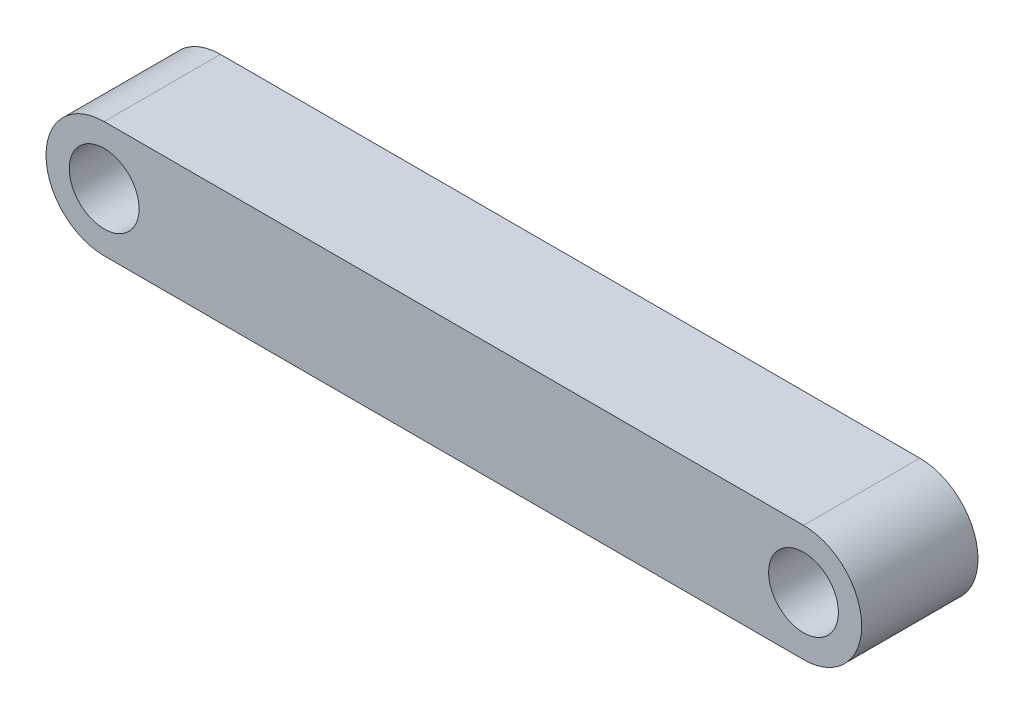
ISO-10303-21;
HEADER;
FILE_DESCRIPTION(('STEP AP214'),'2;1');
FILE_NAME('part.step','',(''),(''),'','','');
FILE_SCHEMA(('AUTOMOTIVE_DESIGN { 1 0 10303 214 1 1 1 1 }'));
ENDSEC;
DATA;
#1=APPLICATION_CONTEXT('core data for automotive mechanical design processes');
#2=APPLICATION_PROTOCOL_DEFINITION('international standard','automotive_design',2000,#1);
#3=PRODUCT_CONTEXT('',#1,'mechanical');
#4=PRODUCT('Part','Part','',(#3));
#5=PRODUCT_RELATED_PRODUCT_CATEGORY('part','',(#4));
#6=PRODUCT_DEFINITION_FORMATION('','',#4);
#7=PRODUCT_DEFINITION_CONTEXT('part definition',#1,'design');
#8=PRODUCT_DEFINITION('design','',#6,#7);
#9=PRODUCT_DEFINITION_SHAPE('','',#8);
#10=(LENGTH_UNIT() NAMED_UNIT(*) SI_UNIT(.MILLI.,.METRE.));
#11=(NAMED_UNIT(*) PLANE_ANGLE_UNIT() SI_UNIT($,.RADIAN.));
#12=(NAMED_UNIT(*) SI_UNIT($,.STERADIAN.) SOLID_ANGLE_UNIT());
#13=UNCERTAINTY_MEASURE_WITH_UNIT(LENGTH_MEASURE(1.E-05),#10,'distance_accuracy_value','');
#14=(GEOMETRIC_REPRESENTATION_CONTEXT(3) GLOBAL_UNCERTAINTY_ASSIGNED_CONTEXT((#13)) GLOBAL_UNIT_ASSIGNED_CONTEXT((#10,
#11,#12)) REPRESENTATION_CONTEXT('',''));
#15=CARTESIAN_POINT('',(0.,0.,0.));
#16=DIRECTION('',(0.,0.,1.));
#17=DIRECTION('',(1.,0.,0.));
#18=AXIS2_PLACEMENT_3D('',#15,#16,#17);
#19=CARTESIAN_POINT('',(-15.03125,0.,2.5));
#20=DIRECTION('',(0.,0.,1.));
#21=DIRECTION('',(1.,0.,0.));
#22=AXIS2_PLACEMENT_3D('',#19,#20,#21);
#23=PLANE('',#22);
#24=CARTESIAN_POINT('',(-15.03125,0.,2.5));
#25=DIRECTION('',(0.,0.,1.));
#26=DIRECTION('',(1.,0.,0.));
#27=AXIS2_PLACEMENT_3D('',#24,#25,#26);
#28=CIRCLE('',#27,1.5);
#29=CARTESIAN_POINT('',(-13.53125,0.,2.5));
#30=VERTEX_POINT('',#29);
#31=EDGE_CURVE('E102',#30,#30,#28,.T.);
#32=ORIENTED_EDGE('',*,*,#31,.F.);
#33=EDGE_LOOP('',(#32));
#34=FACE_BOUND('',#33,.T.);
#35=CARTESIAN_POINT('',(-15.03125,0.,2.5));
#36=DIRECTION('',(0.,0.,1.));
#37=DIRECTION('',(1.,0.,0.));
#38=AXIS2_PLACEMENT_3D('',#35,#36,#37);
#39=CIRCLE('',#38,2.5);
#40=CARTESIAN_POINT('',(-15.03125,2.5,2.5));
#41=VERTEX_POINT('',#40);
#42=CARTESIAN_POINT('',(-15.03125,-2.5,2.5));
#43=VERTEX_POINT('',#42);
#44=EDGE_CURVE('E87',#41,#43,#39,.T.);
#45=ORIENTED_EDGE('',*,*,#44,.T.);
#46=DIRECTION('',(1.,0.,0.));
#47=VECTOR('',#46,1.);
#48=CARTESIAN_POINT('',(-15.03125,-2.5,2.5));
#49=LINE('',#48,#47);
#50=CARTESIAN_POINT('',(15.03125,-2.49999999999999,2.5));
#51=VERTEX_POINT('',#50);
#52=EDGE_CURVE('E82',#43,#51,#49,.T.);
#53=ORIENTED_EDGE('',*,*,#52,.T.);
#54=CARTESIAN_POINT('',(15.03125,0.,2.5));
#55=DIRECTION('',(0.,0.,1.));
#56=DIRECTION('',(1.,0.,0.));
#57=AXIS2_PLACEMENT_3D('',#54,#55,#56);
#58=CIRCLE('',#57,2.5);
#59=CARTESIAN_POINT('',(15.03125,2.50000000000001,2.5));
#60=VERTEX_POINT('',#59);
#61=EDGE_CURVE('E85',#51,#60,#58,.T.);
#62=ORIENTED_EDGE('',*,*,#61,.T.);
#63=DIRECTION('',(-1.,0.,0.));
#64=VECTOR('',#63,1.);
#65=CARTESIAN_POINT('',(-15.03125,2.5,2.5));
#66=LINE('',#65,#64);
#67=EDGE_CURVE('E52',#60,#41,#66,.T.);
#68=ORIENTED_EDGE('',*,*,#67,.T.);
#69=EDGE_LOOP('',(#45,#53,#62,#68));
#70=FACE_BOUND('',#69,.T.);
#71=CARTESIAN_POINT('',(15.03125,0.,2.5));
#72=DIRECTION('',(0.,0.,1.));
#73=DIRECTION('',(1.,0.,0.));
#74=AXIS2_PLACEMENT_3D('',#71,#72,#73);
#75=CIRCLE('',#74,1.5);
#76=CARTESIAN_POINT('',(16.53125,0.,2.5));
#77=VERTEX_POINT('',#76);
#78=EDGE_CURVE('E117',#77,#77,#75,.T.);
#79=ORIENTED_EDGE('',*,*,#78,.F.);
#80=EDGE_LOOP('',(#79));
#81=FACE_BOUND('',#80,.T.);
#82=ADVANCED_FACE('F35',(#34,#70,#81),#23,.T.);
#83=CARTESIAN_POINT('',(-15.03125,0.,-2.5));
#84=DIRECTION('',(0.,0.,1.));
#85=DIRECTION('',(1.,0.,0.));
#86=AXIS2_PLACEMENT_3D('',#83,#84,#85);
#87=PLANE('',#86);
#88=CARTESIAN_POINT('',(-15.03125,0.,-2.5));
#89=DIRECTION('',(0.,0.,1.));
#90=DIRECTION('',(1.,0.,0.));
#91=AXIS2_PLACEMENT_3D('',#88,#89,#90);
#92=CIRCLE('',#91,2.5);
#93=CARTESIAN_POINT('',(-15.03125,2.5,-2.5));
#94=VERTEX_POINT('',#93);
#95=CARTESIAN_POINT('',(-15.03125,-2.5,-2.5));
#96=VERTEX_POINT('',#95);
#97=EDGE_CURVE('E99',#94,#96,#92,.T.);
#98=ORIENTED_EDGE('',*,*,#97,.F.);
#99=DIRECTION('',(-1.,0.,0.));
#100=VECTOR('',#99,1.);
#101=CARTESIAN_POINT('',(-15.03125,2.5,-2.5));
#102=LINE('',#101,#100);
#103=CARTESIAN_POINT('',(15.03125,2.50000000000001,-2.5));
#104=VERTEX_POINT('',#103);
#105=EDGE_CURVE('E75',#104,#94,#102,.T.);
#106=ORIENTED_EDGE('',*,*,#105,.F.);
#107=CARTESIAN_POINT('',(15.03125,0.,-2.5));
#108=DIRECTION('',(0.,0.,1.));
#109=DIRECTION('',(1.,0.,0.));
#110=AXIS2_PLACEMENT_3D('',#107,#108,#109);
#111=CIRCLE('',#110,2.5);
#112=CARTESIAN_POINT('',(15.03125,-2.49999999999999,-2.5));
#113=VERTEX_POINT('',#112);
#114=EDGE_CURVE('E69',#113,#104,#111,.T.);
#115=ORIENTED_EDGE('',*,*,#114,.F.);
#116=DIRECTION('',(1.,0.,0.));
#117=VECTOR('',#116,1.);
#118=CARTESIAN_POINT('',(-15.03125,-2.5,-2.5));
#119=LINE('',#118,#117);
#120=EDGE_CURVE('E91',#96,#113,#119,.T.);
#121=ORIENTED_EDGE('',*,*,#120,.F.);
#122=EDGE_LOOP('',(#98,#106,#115,#121));
#123=FACE_BOUND('',#122,.T.);
#124=CARTESIAN_POINT('',(-15.03125,0.,-2.5));
#125=DIRECTION('',(0.,0.,1.));
#126=DIRECTION('',(1.,0.,0.));
#127=AXIS2_PLACEMENT_3D('',#124,#125,#126);
#128=CIRCLE('',#127,1.5);
#129=CARTESIAN_POINT('',(-13.53125,0.,-2.5));
#130=VERTEX_POINT('',#129);
#131=EDGE_CURVE('E114',#130,#130,#128,.T.);
#132=ORIENTED_EDGE('',*,*,#131,.T.);
#133=EDGE_LOOP('',(#132));
#134=FACE_BOUND('',#133,.T.);
#135=CARTESIAN_POINT('',(15.03125,0.,-2.5));
#136=DIRECTION('',(0.,0.,1.));
#137=DIRECTION('',(1.,0.,0.));
#138=AXIS2_PLACEMENT_3D('',#135,#136,#137);
#139=CIRCLE('',#138,1.5);
#140=CARTESIAN_POINT('',(16.53125,0.,-2.5));
#141=VERTEX_POINT('',#140);
#142=EDGE_CURVE('E120',#141,#141,#139,.T.);
#143=ORIENTED_EDGE('',*,*,#142,.T.);
#144=EDGE_LOOP('',(#143));
#145=FACE_BOUND('',#144,.T.);
#146=ADVANCED_FACE('F110',(#123,#134,#145),#87,.F.);
#147=CARTESIAN_POINT('',(-15.03125,0.,2.5));
#148=DIRECTION('',(0.,0.,-1.));
#149=DIRECTION('',(-1.,0.,0.));
#150=AXIS2_PLACEMENT_3D('',#147,#148,#149);
#151=CYLINDRICAL_SURFACE('',#150,2.5);
#152=ORIENTED_EDGE('',*,*,#97,.T.);
#153=DIRECTION('',(0.,0.,-1.));
#154=VECTOR('',#153,1.);
#155=CARTESIAN_POINT('',(-15.03125,-2.5,2.5));
#156=LINE('',#155,#154);
#157=EDGE_CURVE('E11',#43,#96,#156,.T.);
#158=ORIENTED_EDGE('',*,*,#157,.F.);
#159=ORIENTED_EDGE('',*,*,#44,.F.);
#160=DIRECTION('',(0.,0.,-1.));
#161=VECTOR('',#160,1.);
#162=CARTESIAN_POINT('',(-15.03125,2.5,2.5));
#163=LINE('',#162,#161);
#164=EDGE_CURVE('E95',#41,#94,#163,.T.);
#165=ORIENTED_EDGE('',*,*,#164,.T.);
#166=EDGE_LOOP('',(#152,#158,#159,#165));
#167=FACE_BOUND('',#166,.T.);
#168=ADVANCED_FACE('F37',(#167),#151,.T.);
#169=CARTESIAN_POINT('',(-15.03125,-2.5,2.5));
#170=DIRECTION('',(0.,1.,0.));
#171=DIRECTION('',(-1.,0.,0.));
#172=AXIS2_PLACEMENT_3D('',#169,#170,#171);
#173=PLANE('',#172);
#174=ORIENTED_EDGE('',*,*,#120,.T.);
#175=DIRECTION('',(0.,0.,-1.));
#176=VECTOR('',#175,1.);
#177=CARTESIAN_POINT('',(15.03125,-2.49999999999999,2.5));
#178=LINE('',#177,#176);
#179=EDGE_CURVE('E44',#51,#113,#178,.T.);
#180=ORIENTED_EDGE('',*,*,#179,.F.);
#181=ORIENTED_EDGE('',*,*,#52,.F.);
#182=ORIENTED_EDGE('',*,*,#157,.T.);
#183=EDGE_LOOP('',(#174,#180,#181,#182));
#184=FACE_BOUND('',#183,.T.);
#185=ADVANCED_FACE('F90',(#184),#173,.F.);
#186=CARTESIAN_POINT('',(15.03125,0.,2.5));
#187=DIRECTION('',(0.,0.,-1.));
#188=DIRECTION('',(-1.,0.,0.));
#189=AXIS2_PLACEMENT_3D('',#186,#187,#188);
#190=CYLINDRICAL_SURFACE('',#189,2.5);
#191=ORIENTED_EDGE('',*,*,#114,.T.);
#192=DIRECTION('',(0.,0.,-1.));
#193=VECTOR('',#192,1.);
#194=CARTESIAN_POINT('',(15.03125,2.50000000000001,2.5));
#195=LINE('',#194,#193);
#196=EDGE_CURVE('E92',#60,#104,#195,.T.);
#197=ORIENTED_EDGE('',*,*,#196,.F.);
#198=ORIENTED_EDGE('',*,*,#61,.F.);
#199=ORIENTED_EDGE('',*,*,#179,.T.);
#200=EDGE_LOOP('',(#191,#197,#198,#199));
#201=FACE_BOUND('',#200,.T.);
#202=ADVANCED_FACE('F93',(#201),#190,.T.);
#203=CARTESIAN_POINT('',(-15.03125,2.5,2.5));
#204=DIRECTION('',(0.,-1.,0.));
#205=DIRECTION('',(1.,0.,0.));
#206=AXIS2_PLACEMENT_3D('',#203,#204,#205);
#207=PLANE('',#206);
#208=ORIENTED_EDGE('',*,*,#105,.T.);
#209=ORIENTED_EDGE('',*,*,#164,.F.);
#210=ORIENTED_EDGE('',*,*,#67,.F.);
#211=ORIENTED_EDGE('',*,*,#196,.T.);
#212=EDGE_LOOP('',(#208,#209,#210,#211));
#213=FACE_BOUND('',#212,.T.);
#214=ADVANCED_FACE('F107',(#213),#207,.F.);
#215=CARTESIAN_POINT('',(-15.03125,0.,2.5));
#216=DIRECTION('',(0.,0.,-1.));
#217=DIRECTION('',(-1.,0.,0.));
#218=AXIS2_PLACEMENT_3D('',#215,#216,#217);
#219=CYLINDRICAL_SURFACE('',#218,1.5);
#220=ORIENTED_EDGE('',*,*,#31,.T.);
#221=EDGE_LOOP('',(#220));
#222=FACE_BOUND('',#221,.T.);
#223=ORIENTED_EDGE('',*,*,#131,.F.);
#224=EDGE_LOOP('',(#223));
#225=FACE_BOUND('',#224,.T.);
#226=ADVANCED_FACE('F137',(#222,#225),#219,.F.);
#227=CARTESIAN_POINT('',(15.03125,0.,2.5));
#228=DIRECTION('',(0.,0.,-1.));
#229=DIRECTION('',(-1.,0.,0.));
#230=AXIS2_PLACEMENT_3D('',#227,#228,#229);
#231=CYLINDRICAL_SURFACE('',#230,1.5);
#232=ORIENTED_EDGE('',*,*,#78,.T.);
#233=EDGE_LOOP('',(#232));
#234=FACE_BOUND('',#233,.T.);
#235=ORIENTED_EDGE('',*,*,#142,.F.);
#236=EDGE_LOOP('',(#235));
#237=FACE_BOUND('',#236,.T.);
#238=ADVANCED_FACE('F126',(#234,#237),#231,.F.);
#239=CLOSED_SHELL('',(#82,#146,#168,#185,#202,#214,#226,#238));
#240=MANIFOLD_SOLID_BREP('B2',#239);
#241=ADVANCED_BREP_SHAPE_REPRESENTATION('',(#18,#240),#14);
#242=SHAPE_DEFINITION_REPRESENTATION(#9,#241);
ENDSEC;
END-ISO-10303-21;
